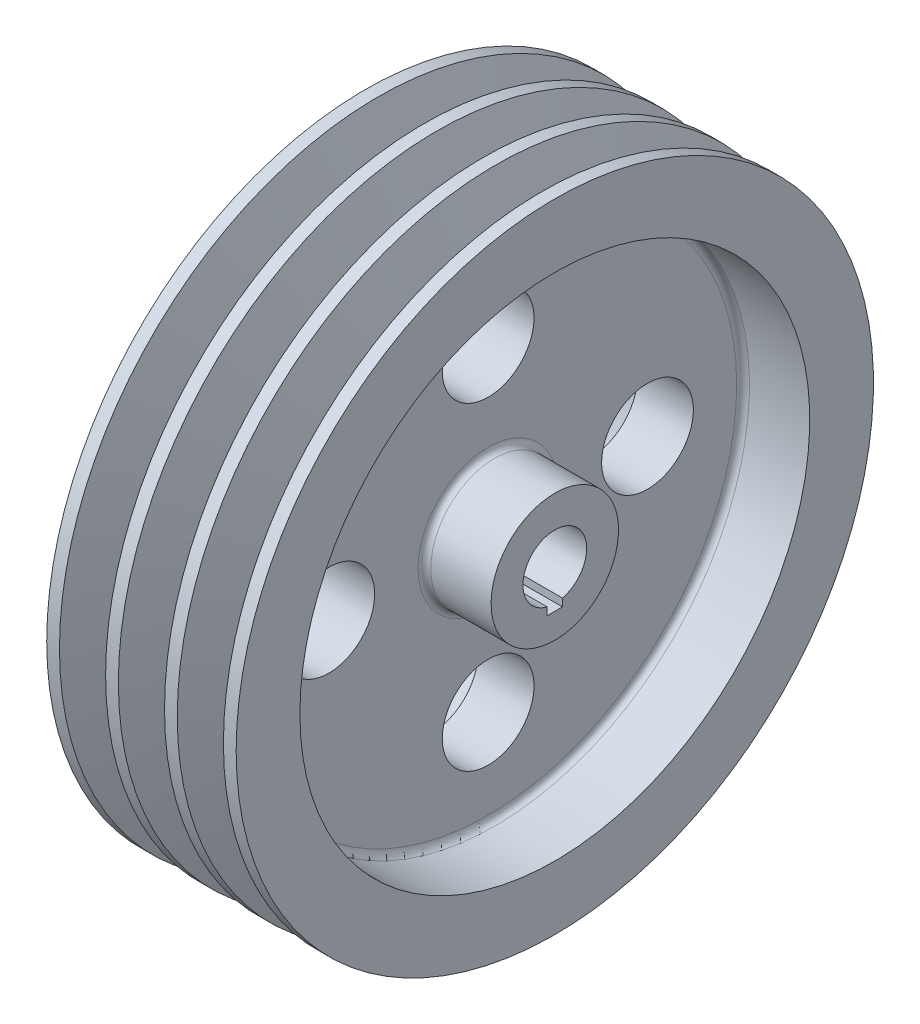
ISO-10303-21;
HEADER;
FILE_DESCRIPTION(('STEP AP214'),'2;1');
FILE_NAME('part.step','',(''),(''),'','','');
FILE_SCHEMA(('AUTOMOTIVE_DESIGN { 1 0 10303 214 1 1 1 1 }'));
ENDSEC;
DATA;
#1=APPLICATION_CONTEXT('core data for automotive mechanical design processes');
#2=APPLICATION_PROTOCOL_DEFINITION('international standard','automotive_design',2000,#1);
#3=PRODUCT_CONTEXT('',#1,'mechanical');
#4=PRODUCT('Part','Part','',(#3));
#5=PRODUCT_RELATED_PRODUCT_CATEGORY('part','',(#4));
#6=PRODUCT_DEFINITION_FORMATION('','',#4);
#7=PRODUCT_DEFINITION_CONTEXT('part definition',#1,'design');
#8=PRODUCT_DEFINITION('design','',#6,#7);
#9=PRODUCT_DEFINITION_SHAPE('','',#8);
#10=(LENGTH_UNIT() NAMED_UNIT(*) SI_UNIT(.MILLI.,.METRE.));
#11=(NAMED_UNIT(*) PLANE_ANGLE_UNIT() SI_UNIT($,.RADIAN.));
#12=(NAMED_UNIT(*) SI_UNIT($,.STERADIAN.) SOLID_ANGLE_UNIT());
#13=UNCERTAINTY_MEASURE_WITH_UNIT(LENGTH_MEASURE(1.E-05),#10,'distance_accuracy_value','');
#14=(GEOMETRIC_REPRESENTATION_CONTEXT(3) GLOBAL_UNCERTAINTY_ASSIGNED_CONTEXT((#13)) GLOBAL_UNIT_ASSIGNED_CONTEXT((#10,
#11,#12)) REPRESENTATION_CONTEXT('',''));
#15=CARTESIAN_POINT('',(0.,0.,0.));
#16=DIRECTION('',(0.,0.,1.));
#17=DIRECTION('',(1.,0.,0.));
#18=AXIS2_PLACEMENT_3D('',#15,#16,#17);
#19=CARTESIAN_POINT('',(-67.9439781808472,0.,0.));
#20=DIRECTION('',(-1.,0.,0.));
#21=DIRECTION('',(0.,0.,1.));
#22=AXIS2_PLACEMENT_3D('',#19,#20,#21);
#23=CYLINDRICAL_SURFACE('',#22,125.);
#24=CARTESIAN_POINT('',(0.,0.,0.));
#25=DIRECTION('',(-1.,0.,0.));
#26=DIRECTION('',(0.,0.,1.));
#27=AXIS2_PLACEMENT_3D('',#24,#25,#26);
#28=CIRCLE('',#27,125.);
#29=CARTESIAN_POINT('',(0.,0.,125.));
#30=VERTEX_POINT('',#29);
#31=EDGE_CURVE('E133',#30,#30,#28,.T.);
#32=ORIENTED_EDGE('',*,*,#31,.F.);
#33=EDGE_LOOP('',(#32));
#34=FACE_BOUND('',#33,.T.);
#35=CARTESIAN_POINT('',(5.,0.,0.));
#36=DIRECTION('',(-1.,0.,0.));
#37=DIRECTION('',(0.,0.,1.));
#38=AXIS2_PLACEMENT_3D('',#35,#36,#37);
#39=CIRCLE('',#38,125.);
#40=CARTESIAN_POINT('',(5.,0.,125.));
#41=VERTEX_POINT('',#40);
#42=EDGE_CURVE('E11',#41,#41,#39,.T.);
#43=ORIENTED_EDGE('',*,*,#42,.T.);
#44=EDGE_LOOP('',(#43));
#45=FACE_BOUND('',#44,.T.);
#46=ADVANCED_FACE('F37',(#34,#45),#23,.T.);
#47=CARTESIAN_POINT('',(11.5514642167916,0.,0.));
#48=DIRECTION('',(-1.,0.,0.));
#49=DIRECTION('',(0.,0.,1.));
#50=AXIS2_PLACEMENT_3D('',#47,#48,#49);
#51=CONICAL_SURFACE('',#50,107.,1.22173047639603);
#52=ORIENTED_EDGE('',*,*,#42,.F.);
#53=EDGE_LOOP('',(#52));
#54=FACE_BOUND('',#53,.T.);
#55=CARTESIAN_POINT('',(11.5514642167916,0.,0.));
#56=DIRECTION('',(-1.,0.,0.));
#57=DIRECTION('',(0.,0.,1.));
#58=AXIS2_PLACEMENT_3D('',#55,#56,#57);
#59=CIRCLE('',#58,107.);
#60=CARTESIAN_POINT('',(11.5514642167916,0.,107.));
#61=VERTEX_POINT('',#60);
#62=EDGE_CURVE('E44',#61,#61,#59,.T.);
#63=ORIENTED_EDGE('',*,*,#62,.T.);
#64=EDGE_LOOP('',(#63));
#65=FACE_BOUND('',#64,.T.);
#66=ADVANCED_FACE('F211',(#54,#65),#51,.T.);
#67=CARTESIAN_POINT('',(-67.9439781808472,0.,0.));
#68=DIRECTION('',(-1.,0.,0.));
#69=DIRECTION('',(0.,0.,1.));
#70=AXIS2_PLACEMENT_3D('',#67,#68,#69);
#71=CYLINDRICAL_SURFACE('',#70,107.);
#72=ORIENTED_EDGE('',*,*,#62,.F.);
#73=EDGE_LOOP('',(#72));
#74=FACE_BOUND('',#73,.T.);
#75=CARTESIAN_POINT('',(16.5514642167916,0.,0.));
#76=DIRECTION('',(-1.,0.,0.));
#77=DIRECTION('',(0.,0.,1.));
#78=AXIS2_PLACEMENT_3D('',#75,#76,#77);
#79=CIRCLE('',#78,107.);
#80=CARTESIAN_POINT('',(16.5514642167916,0.,107.));
#81=VERTEX_POINT('',#80);
#82=EDGE_CURVE('E206',#81,#81,#79,.T.);
#83=ORIENTED_EDGE('',*,*,#82,.T.);
#84=EDGE_LOOP('',(#83));
#85=FACE_BOUND('',#84,.T.);
#86=ADVANCED_FACE('F213',(#74,#85),#71,.T.);
#87=CARTESIAN_POINT('',(23.1029284335832,0.,0.));
#88=DIRECTION('',(1.,0.,0.));
#89=DIRECTION('',(0.,0.,-1.));
#90=AXIS2_PLACEMENT_3D('',#87,#88,#89);
#91=CONICAL_SURFACE('',#90,125.,1.22173047639603);
#92=ORIENTED_EDGE('',*,*,#82,.F.);
#93=EDGE_LOOP('',(#92));
#94=FACE_BOUND('',#93,.T.);
#95=CARTESIAN_POINT('',(23.1029284335832,0.,0.));
#96=DIRECTION('',(-1.,0.,0.));
#97=DIRECTION('',(0.,0.,1.));
#98=AXIS2_PLACEMENT_3D('',#95,#96,#97);
#99=CIRCLE('',#98,125.);
#100=CARTESIAN_POINT('',(23.1029284335832,0.,125.));
#101=VERTEX_POINT('',#100);
#102=EDGE_CURVE('E203',#101,#101,#99,.T.);
#103=ORIENTED_EDGE('',*,*,#102,.T.);
#104=EDGE_LOOP('',(#103));
#105=FACE_BOUND('',#104,.T.);
#106=ADVANCED_FACE('F216',(#94,#105),#91,.T.);
#107=CARTESIAN_POINT('',(-67.9439781808472,0.,0.));
#108=DIRECTION('',(-1.,0.,0.));
#109=DIRECTION('',(0.,0.,1.));
#110=AXIS2_PLACEMENT_3D('',#107,#108,#109);
#111=CYLINDRICAL_SURFACE('',#110,125.);
#112=ORIENTED_EDGE('',*,*,#102,.F.);
#113=EDGE_LOOP('',(#112));
#114=FACE_BOUND('',#113,.T.);
#115=CARTESIAN_POINT('',(28.1029284335832,0.,0.));
#116=DIRECTION('',(-1.,0.,0.));
#117=DIRECTION('',(0.,0.,1.));
#118=AXIS2_PLACEMENT_3D('',#115,#116,#117);
#119=CIRCLE('',#118,125.);
#120=CARTESIAN_POINT('',(28.1029284335832,0.,125.));
#121=VERTEX_POINT('',#120);
#122=EDGE_CURVE('E200',#121,#121,#119,.T.);
#123=ORIENTED_EDGE('',*,*,#122,.T.);
#124=EDGE_LOOP('',(#123));
#125=FACE_BOUND('',#124,.T.);
#126=ADVANCED_FACE('F222',(#114,#125),#111,.T.);
#127=CARTESIAN_POINT('',(34.6543926503748,0.,0.));
#128=DIRECTION('',(-1.,0.,0.));
#129=DIRECTION('',(0.,0.,1.));
#130=AXIS2_PLACEMENT_3D('',#127,#128,#129);
#131=CONICAL_SURFACE('',#130,107.,1.22173047639603);
#132=ORIENTED_EDGE('',*,*,#122,.F.);
#133=EDGE_LOOP('',(#132));
#134=FACE_BOUND('',#133,.T.);
#135=CARTESIAN_POINT('',(34.6543926503748,0.,0.));
#136=DIRECTION('',(-1.,0.,0.));
#137=DIRECTION('',(0.,0.,1.));
#138=AXIS2_PLACEMENT_3D('',#135,#136,#137);
#139=CIRCLE('',#138,107.);
#140=CARTESIAN_POINT('',(34.6543926503748,0.,107.));
#141=VERTEX_POINT('',#140);
#142=EDGE_CURVE('E197',#141,#141,#139,.T.);
#143=ORIENTED_EDGE('',*,*,#142,.T.);
#144=EDGE_LOOP('',(#143));
#145=FACE_BOUND('',#144,.T.);
#146=ADVANCED_FACE('F228',(#134,#145),#131,.T.);
#147=CARTESIAN_POINT('',(-67.9439781808472,0.,0.));
#148=DIRECTION('',(-1.,0.,0.));
#149=DIRECTION('',(0.,0.,1.));
#150=AXIS2_PLACEMENT_3D('',#147,#148,#149);
#151=CYLINDRICAL_SURFACE('',#150,107.);
#152=ORIENTED_EDGE('',*,*,#142,.F.);
#153=EDGE_LOOP('',(#152));
#154=FACE_BOUND('',#153,.T.);
#155=CARTESIAN_POINT('',(39.6543926503748,0.,0.));
#156=DIRECTION('',(-1.,0.,0.));
#157=DIRECTION('',(0.,0.,1.));
#158=AXIS2_PLACEMENT_3D('',#155,#156,#157);
#159=CIRCLE('',#158,107.);
#160=CARTESIAN_POINT('',(39.6543926503748,0.,107.));
#161=VERTEX_POINT('',#160);
#162=EDGE_CURVE('E194',#161,#161,#159,.T.);
#163=ORIENTED_EDGE('',*,*,#162,.T.);
#164=EDGE_LOOP('',(#163));
#165=FACE_BOUND('',#164,.T.);
#166=ADVANCED_FACE('F234',(#154,#165),#151,.T.);
#167=CARTESIAN_POINT('',(46.2058568671665,0.,0.));
#168=DIRECTION('',(1.,0.,0.));
#169=DIRECTION('',(0.,0.,-1.));
#170=AXIS2_PLACEMENT_3D('',#167,#168,#169);
#171=CONICAL_SURFACE('',#170,125.,1.22173047639603);
#172=ORIENTED_EDGE('',*,*,#162,.F.);
#173=EDGE_LOOP('',(#172));
#174=FACE_BOUND('',#173,.T.);
#175=CARTESIAN_POINT('',(46.2058568671665,0.,0.));
#176=DIRECTION('',(-1.,0.,0.));
#177=DIRECTION('',(0.,0.,1.));
#178=AXIS2_PLACEMENT_3D('',#175,#176,#177);
#179=CIRCLE('',#178,125.);
#180=CARTESIAN_POINT('',(46.2058568671665,0.,125.));
#181=VERTEX_POINT('',#180);
#182=EDGE_CURVE('E191',#181,#181,#179,.T.);
#183=ORIENTED_EDGE('',*,*,#182,.T.);
#184=EDGE_LOOP('',(#183));
#185=FACE_BOUND('',#184,.T.);
#186=ADVANCED_FACE('F240',(#174,#185),#171,.T.);
#187=CARTESIAN_POINT('',(-67.9439781808472,0.,0.));
#188=DIRECTION('',(-1.,0.,0.));
#189=DIRECTION('',(0.,0.,1.));
#190=AXIS2_PLACEMENT_3D('',#187,#188,#189);
#191=CYLINDRICAL_SURFACE('',#190,125.);
#192=ORIENTED_EDGE('',*,*,#182,.F.);
#193=EDGE_LOOP('',(#192));
#194=FACE_BOUND('',#193,.T.);
#195=CARTESIAN_POINT('',(51.2058568671665,0.,0.));
#196=DIRECTION('',(-1.,0.,0.));
#197=DIRECTION('',(0.,0.,1.));
#198=AXIS2_PLACEMENT_3D('',#195,#196,#197);
#199=CIRCLE('',#198,125.);
#200=CARTESIAN_POINT('',(51.2058568671665,0.,125.));
#201=VERTEX_POINT('',#200);
#202=EDGE_CURVE('E188',#201,#201,#199,.T.);
#203=ORIENTED_EDGE('',*,*,#202,.T.);
#204=EDGE_LOOP('',(#203));
#205=FACE_BOUND('',#204,.T.);
#206=ADVANCED_FACE('F246',(#194,#205),#191,.T.);
#207=CARTESIAN_POINT('',(57.757321083958,0.,0.));
#208=DIRECTION('',(-1.,0.,0.));
#209=DIRECTION('',(0.,0.,1.));
#210=AXIS2_PLACEMENT_3D('',#207,#208,#209);
#211=CONICAL_SURFACE('',#210,107.,1.22173047639604);
#212=ORIENTED_EDGE('',*,*,#202,.F.);
#213=EDGE_LOOP('',(#212));
#214=FACE_BOUND('',#213,.T.);
#215=CARTESIAN_POINT('',(57.757321083958,0.,0.));
#216=DIRECTION('',(-1.,0.,0.));
#217=DIRECTION('',(0.,0.,1.));
#218=AXIS2_PLACEMENT_3D('',#215,#216,#217);
#219=CIRCLE('',#218,107.);
#220=CARTESIAN_POINT('',(57.757321083958,0.,107.));
#221=VERTEX_POINT('',#220);
#222=EDGE_CURVE('E185',#221,#221,#219,.T.);
#223=ORIENTED_EDGE('',*,*,#222,.T.);
#224=EDGE_LOOP('',(#223));
#225=FACE_BOUND('',#224,.T.);
#226=ADVANCED_FACE('F252',(#214,#225),#211,.T.);
#227=CARTESIAN_POINT('',(-67.9439781808472,0.,0.));
#228=DIRECTION('',(-1.,0.,0.));
#229=DIRECTION('',(0.,0.,1.));
#230=AXIS2_PLACEMENT_3D('',#227,#228,#229);
#231=CYLINDRICAL_SURFACE('',#230,107.);
#232=ORIENTED_EDGE('',*,*,#222,.F.);
#233=EDGE_LOOP('',(#232));
#234=FACE_BOUND('',#233,.T.);
#235=CARTESIAN_POINT('',(62.757321083958,0.,0.));
#236=DIRECTION('',(-1.,0.,0.));
#237=DIRECTION('',(0.,0.,1.));
#238=AXIS2_PLACEMENT_3D('',#235,#236,#237);
#239=CIRCLE('',#238,107.);
#240=CARTESIAN_POINT('',(62.757321083958,0.,107.));
#241=VERTEX_POINT('',#240);
#242=EDGE_CURVE('E182',#241,#241,#239,.T.);
#243=ORIENTED_EDGE('',*,*,#242,.T.);
#244=EDGE_LOOP('',(#243));
#245=FACE_BOUND('',#244,.T.);
#246=ADVANCED_FACE('F258',(#234,#245),#231,.T.);
#247=CARTESIAN_POINT('',(69.3087853007496,0.,0.));
#248=DIRECTION('',(1.,0.,0.));
#249=DIRECTION('',(0.,0.,-1.));
#250=AXIS2_PLACEMENT_3D('',#247,#248,#249);
#251=CONICAL_SURFACE('',#250,125.,1.22173047639603);
#252=ORIENTED_EDGE('',*,*,#242,.F.);
#253=EDGE_LOOP('',(#252));
#254=FACE_BOUND('',#253,.T.);
#255=CARTESIAN_POINT('',(69.3087853007496,0.,0.));
#256=DIRECTION('',(-1.,0.,0.));
#257=DIRECTION('',(0.,0.,1.));
#258=AXIS2_PLACEMENT_3D('',#255,#256,#257);
#259=CIRCLE('',#258,125.);
#260=CARTESIAN_POINT('',(69.3087853007496,0.,125.));
#261=VERTEX_POINT('',#260);
#262=EDGE_CURVE('E179',#261,#261,#259,.T.);
#263=ORIENTED_EDGE('',*,*,#262,.T.);
#264=EDGE_LOOP('',(#263));
#265=FACE_BOUND('',#264,.T.);
#266=ADVANCED_FACE('F264',(#254,#265),#251,.T.);
#267=CARTESIAN_POINT('',(-67.9439781808472,0.,0.));
#268=DIRECTION('',(-1.,0.,0.));
#269=DIRECTION('',(0.,0.,1.));
#270=AXIS2_PLACEMENT_3D('',#267,#268,#269);
#271=CYLINDRICAL_SURFACE('',#270,125.);
#272=ORIENTED_EDGE('',*,*,#262,.F.);
#273=EDGE_LOOP('',(#272));
#274=FACE_BOUND('',#273,.T.);
#275=CARTESIAN_POINT('',(74.3087853007496,0.,0.));
#276=DIRECTION('',(-1.,0.,0.));
#277=DIRECTION('',(0.,0.,1.));
#278=AXIS2_PLACEMENT_3D('',#275,#276,#277);
#279=CIRCLE('',#278,125.);
#280=CARTESIAN_POINT('',(74.3087853007496,0.,125.));
#281=VERTEX_POINT('',#280);
#282=EDGE_CURVE('E176',#281,#281,#279,.T.);
#283=ORIENTED_EDGE('',*,*,#282,.T.);
#284=EDGE_LOOP('',(#283));
#285=FACE_BOUND('',#284,.T.);
#286=ADVANCED_FACE('F270',(#274,#285),#271,.T.);
#287=CARTESIAN_POINT('',(74.3087853007496,0.,-125.));
#288=DIRECTION('',(-1.,0.,0.));
#289=DIRECTION('',(0.,0.,1.));
#290=AXIS2_PLACEMENT_3D('',#287,#288,#289);
#291=PLANE('',#290);
#292=ORIENTED_EDGE('',*,*,#282,.F.);
#293=EDGE_LOOP('',(#292));
#294=FACE_BOUND('',#293,.T.);
#295=CARTESIAN_POINT('',(74.3087853007496,0.,0.));
#296=DIRECTION('',(-1.,0.,0.));
#297=DIRECTION('',(0.,0.,1.));
#298=AXIS2_PLACEMENT_3D('',#295,#296,#297);
#299=CIRCLE('',#298,100.);
#300=CARTESIAN_POINT('',(74.3087853007496,0.,100.));
#301=VERTEX_POINT('',#300);
#302=EDGE_CURVE('E173',#301,#301,#299,.T.);
#303=ORIENTED_EDGE('',*,*,#302,.T.);
#304=EDGE_LOOP('',(#303));
#305=FACE_BOUND('',#304,.T.);
#306=ADVANCED_FACE('F276',(#294,#305),#291,.F.);
#307=CARTESIAN_POINT('',(-67.9439781808472,0.,0.));
#308=DIRECTION('',(-1.,0.,0.));
#309=DIRECTION('',(0.,0.,1.));
#310=AXIS2_PLACEMENT_3D('',#307,#308,#309);
#311=CYLINDRICAL_SURFACE('',#310,100.);
#312=ORIENTED_EDGE('',*,*,#302,.F.);
#313=EDGE_LOOP('',(#312));
#314=FACE_BOUND('',#313,.T.);
#315=CARTESIAN_POINT('',(50.6543926503748,0.,0.));
#316=DIRECTION('',(-1.,0.,0.));
#317=DIRECTION('',(0.,0.,1.));
#318=AXIS2_PLACEMENT_3D('',#315,#316,#317);
#319=CIRCLE('',#318,100.);
#320=CARTESIAN_POINT('',(50.6543926503748,0.,100.));
#321=VERTEX_POINT('',#320);
#322=EDGE_CURVE('E170',#321,#321,#319,.T.);
#323=ORIENTED_EDGE('',*,*,#322,.T.);
#324=EDGE_LOOP('',(#323));
#325=FACE_BOUND('',#324,.T.);
#326=ADVANCED_FACE('F282',(#314,#325),#311,.F.);
#327=CARTESIAN_POINT('',(50.6543926503748,0.,0.));
#328=DIRECTION('',(-1.,0.,0.));
#329=DIRECTION('',(0.,0.,1.));
#330=AXIS2_PLACEMENT_3D('',#327,#328,#329);
#331=TOROIDAL_SURFACE('',#330,97.5,2.5);
#332=ORIENTED_EDGE('',*,*,#322,.F.);
#333=EDGE_LOOP('',(#332));
#334=FACE_BOUND('',#333,.T.);
#335=CARTESIAN_POINT('',(48.1543926503748,0.,0.));
#336=DIRECTION('',(-1.,0.,0.));
#337=DIRECTION('',(0.,0.,1.));
#338=AXIS2_PLACEMENT_3D('',#335,#336,#337);
#339=CIRCLE('',#338,97.5);
#340=CARTESIAN_POINT('',(48.1543926503748,0.,97.5));
#341=VERTEX_POINT('',#340);
#342=EDGE_CURVE('E167',#341,#341,#339,.T.);
#343=ORIENTED_EDGE('',*,*,#342,.T.);
#344=EDGE_LOOP('',(#343));
#345=FACE_BOUND('',#344,.T.);
#346=ADVANCED_FACE('F288',(#334,#345),#331,.F.);
#347=CARTESIAN_POINT('',(48.1543926503748,0.,-97.5));
#348=DIRECTION('',(-1.,0.,0.));
#349=DIRECTION('',(0.,0.,1.));
#350=AXIS2_PLACEMENT_3D('',#347,#348,#349);
#351=PLANE('',#350);
#352=CARTESIAN_POINT('',(48.1543926503748,62.5,0.));
#353=DIRECTION('',(-1.,0.,0.));
#354=DIRECTION('',(0.,0.,1.));
#355=AXIS2_PLACEMENT_3D('',#352,#353,#354);
#356=CIRCLE('',#355,18.);
#357=CARTESIAN_POINT('',(48.1543926503748,62.5,18.));
#358=VERTEX_POINT('',#357);
#359=EDGE_CURVE('E130',#358,#358,#356,.T.);
#360=ORIENTED_EDGE('',*,*,#359,.T.);
#361=EDGE_LOOP('',(#360));
#362=FACE_BOUND('',#361,.T.);
#363=CARTESIAN_POINT('',(48.1543926503748,-2.18217583677696E-13,62.5));
#364=DIRECTION('',(-1.,0.,0.));
#365=DIRECTION('',(0.,0.,1.));
#366=AXIS2_PLACEMENT_3D('',#363,#364,#365);
#367=CIRCLE('',#366,18.);
#368=CARTESIAN_POINT('',(48.1543926503748,-2.18217583677696E-13,80.5));
#369=VERTEX_POINT('',#368);
#370=EDGE_CURVE('E127',#369,#369,#367,.T.);
#371=ORIENTED_EDGE('',*,*,#370,.T.);
#372=EDGE_LOOP('',(#371));
#373=FACE_BOUND('',#372,.T.);
#374=CARTESIAN_POINT('',(48.1543926503748,-62.5,3.52975155131649E-12));
#375=DIRECTION('',(-1.,0.,0.));
#376=DIRECTION('',(0.,0.,1.));
#377=AXIS2_PLACEMENT_3D('',#374,#375,#376);
#378=CIRCLE('',#377,18.0000000000038);
#379=CARTESIAN_POINT('',(48.1543926503748,-62.5,18.0000000000073));
#380=VERTEX_POINT('',#379);
#381=EDGE_CURVE('E124',#380,#380,#378,.T.);
#382=ORIENTED_EDGE('',*,*,#381,.T.);
#383=EDGE_LOOP('',(#382));
#384=FACE_BOUND('',#383,.T.);
#385=CARTESIAN_POINT('',(48.1543926503748,6.54652751033088E-13,-62.5));
#386=DIRECTION('',(-1.,0.,0.));
#387=DIRECTION('',(0.,0.,1.));
#388=AXIS2_PLACEMENT_3D('',#385,#386,#387);
#389=CIRCLE('',#388,18.);
#390=CARTESIAN_POINT('',(48.1543926503748,6.54652751033088E-13,-44.5));
#391=VERTEX_POINT('',#390);
#392=EDGE_CURVE('E113',#391,#391,#389,.T.);
#393=ORIENTED_EDGE('',*,*,#392,.T.);
#394=EDGE_LOOP('',(#393));
#395=FACE_BOUND('',#394,.T.);
#396=ORIENTED_EDGE('',*,*,#342,.F.);
#397=EDGE_LOOP('',(#396));
#398=FACE_BOUND('',#397,.T.);
#399=CARTESIAN_POINT('',(48.1543926503748,0.,0.));
#400=DIRECTION('',(-1.,0.,0.));
#401=DIRECTION('',(0.,0.,1.));
#402=AXIS2_PLACEMENT_3D('',#399,#400,#401);
#403=CIRCLE('',#402,27.5);
#404=CARTESIAN_POINT('',(48.1543926503748,0.,27.5));
#405=VERTEX_POINT('',#404);
#406=EDGE_CURVE('E164',#405,#405,#403,.T.);
#407=ORIENTED_EDGE('',*,*,#406,.T.);
#408=EDGE_LOOP('',(#407));
#409=FACE_BOUND('',#408,.T.);
#410=ADVANCED_FACE('F294',(#362,#373,#384,#395,#398,#409),#351,.F.);
#411=CARTESIAN_POINT('',(50.6543926503748,0.,0.));
#412=DIRECTION('',(-1.,0.,0.));
#413=DIRECTION('',(0.,0.,1.));
#414=AXIS2_PLACEMENT_3D('',#411,#412,#413);
#415=TOROIDAL_SURFACE('',#414,27.5,2.5);
#416=ORIENTED_EDGE('',*,*,#406,.F.);
#417=EDGE_LOOP('',(#416));
#418=FACE_BOUND('',#417,.T.);
#419=CARTESIAN_POINT('',(50.6543926503748,0.,0.));
#420=DIRECTION('',(-1.,0.,0.));
#421=DIRECTION('',(0.,0.,1.));
#422=AXIS2_PLACEMENT_3D('',#419,#420,#421);
#423=CIRCLE('',#422,25.);
#424=CARTESIAN_POINT('',(50.6543926503748,0.,25.));
#425=VERTEX_POINT('',#424);
#426=EDGE_CURVE('E161',#425,#425,#423,.T.);
#427=ORIENTED_EDGE('',*,*,#426,.T.);
#428=EDGE_LOOP('',(#427));
#429=FACE_BOUND('',#428,.T.);
#430=ADVANCED_FACE('F300',(#418,#429),#415,.F.);
#431=CARTESIAN_POINT('',(-67.9439781808472,0.,0.));
#432=DIRECTION('',(-1.,0.,0.));
#433=DIRECTION('',(0.,0.,1.));
#434=AXIS2_PLACEMENT_3D('',#431,#432,#433);
#435=CYLINDRICAL_SURFACE('',#434,25.);
#436=ORIENTED_EDGE('',*,*,#426,.F.);
#437=EDGE_LOOP('',(#436));
#438=FACE_BOUND('',#437,.T.);
#439=CARTESIAN_POINT('',(74.3087853007496,0.,0.));
#440=DIRECTION('',(-1.,0.,0.));
#441=DIRECTION('',(0.,0.,1.));
#442=AXIS2_PLACEMENT_3D('',#439,#440,#441);
#443=CIRCLE('',#442,25.);
#444=CARTESIAN_POINT('',(74.3087853007496,0.,25.));
#445=VERTEX_POINT('',#444);
#446=EDGE_CURVE('E158',#445,#445,#443,.T.);
#447=ORIENTED_EDGE('',*,*,#446,.T.);
#448=EDGE_LOOP('',(#447));
#449=FACE_BOUND('',#448,.T.);
#450=ADVANCED_FACE('F307',(#438,#449),#435,.T.);
#451=CARTESIAN_POINT('',(74.3087853007496,0.,-22.5));
#452=DIRECTION('',(-1.,0.,0.));
#453=DIRECTION('',(0.,0.,1.));
#454=AXIS2_PLACEMENT_3D('',#451,#452,#453);
#455=PLANE('',#454);
#456=ORIENTED_EDGE('',*,*,#446,.F.);
#457=EDGE_LOOP('',(#456));
#458=FACE_BOUND('',#457,.T.);
#459=DIRECTION('',(0.,0.,1.));
#460=VECTOR('',#459,1.);
#461=CARTESIAN_POINT('',(74.3087853007496,-15.1346610995116,-3.));
#462=LINE('',#461,#460);
#463=CARTESIAN_POINT('',(74.3087853007496,-15.1346610995116,-3.));
#464=VERTEX_POINT('',#463);
#465=CARTESIAN_POINT('',(74.3087853007496,-15.1346610995116,3.));
#466=VERTEX_POINT('',#465);
#467=EDGE_CURVE('E90',#464,#466,#462,.T.);
#468=ORIENTED_EDGE('',*,*,#467,.T.);
#469=DIRECTION('',(0.,1.,0.));
#470=VECTOR('',#469,1.);
#471=CARTESIAN_POINT('',(74.3087853007496,-15.1346610995116,3.));
#472=LINE('',#471,#470);
#473=CARTESIAN_POINT('',(74.3087853007496,-12.1346610995116,3.));
#474=VERTEX_POINT('',#473);
#475=EDGE_CURVE('E93',#466,#474,#472,.T.);
#476=ORIENTED_EDGE('',*,*,#475,.T.);
#477=CARTESIAN_POINT('',(74.3087853007496,0.,0.));
#478=DIRECTION('',(-1.,0.,0.));
#479=DIRECTION('',(0.,0.,1.));
#480=AXIS2_PLACEMENT_3D('',#477,#478,#479);
#481=CIRCLE('',#480,12.5);
#482=CARTESIAN_POINT('',(74.3087853007496,-12.1346610995116,-3.));
#483=VERTEX_POINT('',#482);
#484=EDGE_CURVE('E98',#474,#483,#481,.T.);
#485=ORIENTED_EDGE('',*,*,#484,.T.);
#486=DIRECTION('',(0.,-1.,0.));
#487=VECTOR('',#486,1.);
#488=CARTESIAN_POINT('',(74.3087853007496,-12.1346610995116,-3.));
#489=LINE('',#488,#487);
#490=EDGE_CURVE('E79',#483,#464,#489,.T.);
#491=ORIENTED_EDGE('',*,*,#490,.T.);
#492=EDGE_LOOP('',(#468,#476,#485,#491));
#493=FACE_BOUND('',#492,.T.);
#494=ADVANCED_FACE('F96',(#458,#493),#455,.F.);
#495=CARTESIAN_POINT('',(-67.9439781808472,0.,0.));
#496=DIRECTION('',(-1.,0.,0.));
#497=DIRECTION('',(0.,0.,1.));
#498=AXIS2_PLACEMENT_3D('',#495,#496,#497);
#499=CYLINDRICAL_SURFACE('',#498,12.5);
#500=ORIENTED_EDGE('',*,*,#484,.F.);
#501=DIRECTION('',(-1.,0.,0.));
#502=VECTOR('',#501,1.);
#503=CARTESIAN_POINT('',(74.3087853007496,-12.1346610995116,3.));
#504=LINE('',#503,#502);
#505=CARTESIAN_POINT('',(0.,-12.1346610995116,3.));
#506=VERTEX_POINT('',#505);
#507=EDGE_CURVE('E60',#474,#506,#504,.T.);
#508=ORIENTED_EDGE('',*,*,#507,.T.);
#509=CARTESIAN_POINT('',(0.,0.,0.));
#510=DIRECTION('',(-1.,0.,0.));
#511=DIRECTION('',(0.,0.,1.));
#512=AXIS2_PLACEMENT_3D('',#509,#510,#511);
#513=CIRCLE('',#512,12.5);
#514=CARTESIAN_POINT('',(0.,-12.1346610995116,-3.));
#515=VERTEX_POINT('',#514);
#516=EDGE_CURVE('E154',#506,#515,#513,.T.);
#517=ORIENTED_EDGE('',*,*,#516,.T.);
#518=DIRECTION('',(-1.,0.,0.));
#519=VECTOR('',#518,1.);
#520=CARTESIAN_POINT('',(74.3087853007496,-12.1346610995116,-3.));
#521=LINE('',#520,#519);
#522=EDGE_CURVE('E51',#483,#515,#521,.T.);
#523=ORIENTED_EDGE('',*,*,#522,.F.);
#524=EDGE_LOOP('',(#500,#508,#517,#523));
#525=FACE_BOUND('',#524,.T.);
#526=ADVANCED_FACE('F317',(#525),#499,.F.);
#527=CARTESIAN_POINT('',(0.,0.,-25.));
#528=DIRECTION('',(1.,0.,0.));
#529=DIRECTION('',(0.,0.,-1.));
#530=AXIS2_PLACEMENT_3D('',#527,#528,#529);
#531=PLANE('',#530);
#532=ORIENTED_EDGE('',*,*,#516,.F.);
#533=DIRECTION('',(0.,1.,0.));
#534=VECTOR('',#533,1.);
#535=CARTESIAN_POINT('',(0.,-15.1346610995116,3.));
#536=LINE('',#535,#534);
#537=CARTESIAN_POINT('',(0.,-15.1346610995116,3.));
#538=VERTEX_POINT('',#537);
#539=EDGE_CURVE('E75',#538,#506,#536,.T.);
#540=ORIENTED_EDGE('',*,*,#539,.F.);
#541=DIRECTION('',(0.,0.,1.));
#542=VECTOR('',#541,1.);
#543=CARTESIAN_POINT('',(0.,-15.1346610995116,-3.));
#544=LINE('',#543,#542);
#545=CARTESIAN_POINT('',(0.,-15.1346610995116,-3.));
#546=VERTEX_POINT('',#545);
#547=EDGE_CURVE('E100',#546,#538,#544,.T.);
#548=ORIENTED_EDGE('',*,*,#547,.F.);
#549=DIRECTION('',(0.,-1.,0.));
#550=VECTOR('',#549,1.);
#551=CARTESIAN_POINT('',(0.,-12.1346610995116,-3.));
#552=LINE('',#551,#550);
#553=EDGE_CURVE('E83',#515,#546,#552,.T.);
#554=ORIENTED_EDGE('',*,*,#553,.F.);
#555=EDGE_LOOP('',(#532,#540,#548,#554));
#556=FACE_BOUND('',#555,.T.);
#557=CARTESIAN_POINT('',(0.,0.,0.));
#558=DIRECTION('',(-1.,0.,0.));
#559=DIRECTION('',(0.,0.,1.));
#560=AXIS2_PLACEMENT_3D('',#557,#558,#559);
#561=CIRCLE('',#560,25.);
#562=CARTESIAN_POINT('',(0.,0.,25.));
#563=VERTEX_POINT('',#562);
#564=EDGE_CURVE('E151',#563,#563,#561,.T.);
#565=ORIENTED_EDGE('',*,*,#564,.T.);
#566=EDGE_LOOP('',(#565));
#567=FACE_BOUND('',#566,.T.);
#568=ADVANCED_FACE('F323',(#556,#567),#531,.F.);
#569=CARTESIAN_POINT('',(-67.9439781808472,0.,0.));
#570=DIRECTION('',(-1.,0.,0.));
#571=DIRECTION('',(0.,0.,1.));
#572=AXIS2_PLACEMENT_3D('',#569,#570,#571);
#573=CYLINDRICAL_SURFACE('',#572,25.);
#574=ORIENTED_EDGE('',*,*,#564,.F.);
#575=EDGE_LOOP('',(#574));
#576=FACE_BOUND('',#575,.T.);
#577=CARTESIAN_POINT('',(23.6543926503748,0.,0.));
#578=DIRECTION('',(-1.,0.,0.));
#579=DIRECTION('',(0.,0.,1.));
#580=AXIS2_PLACEMENT_3D('',#577,#578,#579);
#581=CIRCLE('',#580,25.);
#582=CARTESIAN_POINT('',(23.6543926503748,0.,25.));
#583=VERTEX_POINT('',#582);
#584=EDGE_CURVE('E148',#583,#583,#581,.T.);
#585=ORIENTED_EDGE('',*,*,#584,.T.);
#586=EDGE_LOOP('',(#585));
#587=FACE_BOUND('',#586,.T.);
#588=ADVANCED_FACE('F365',(#576,#587),#573,.T.);
#589=CARTESIAN_POINT('',(23.6543926503748,0.,0.));
#590=DIRECTION('',(-1.,0.,0.));
#591=DIRECTION('',(0.,0.,1.));
#592=AXIS2_PLACEMENT_3D('',#589,#590,#591);
#593=TOROIDAL_SURFACE('',#592,27.5,2.5);
#594=ORIENTED_EDGE('',*,*,#584,.F.);
#595=EDGE_LOOP('',(#594));
#596=FACE_BOUND('',#595,.T.);
#597=CARTESIAN_POINT('',(26.1543926503748,0.,0.));
#598=DIRECTION('',(-1.,0.,0.));
#599=DIRECTION('',(0.,0.,1.));
#600=AXIS2_PLACEMENT_3D('',#597,#598,#599);
#601=CIRCLE('',#600,27.5);
#602=CARTESIAN_POINT('',(26.1543926503748,0.,27.5));
#603=VERTEX_POINT('',#602);
#604=EDGE_CURVE('E145',#603,#603,#601,.T.);
#605=ORIENTED_EDGE('',*,*,#604,.T.);
#606=EDGE_LOOP('',(#605));
#607=FACE_BOUND('',#606,.T.);
#608=ADVANCED_FACE('F361',(#596,#607),#593,.F.);
#609=CARTESIAN_POINT('',(26.1543926503748,0.,-97.5));
#610=DIRECTION('',(1.,0.,0.));
#611=DIRECTION('',(0.,0.,-1.));
#612=AXIS2_PLACEMENT_3D('',#609,#610,#611);
#613=PLANE('',#612);
#614=CARTESIAN_POINT('',(26.1543926503748,62.5,0.));
#615=DIRECTION('',(-1.,0.,0.));
#616=DIRECTION('',(0.,0.,1.));
#617=AXIS2_PLACEMENT_3D('',#614,#615,#616);
#618=CIRCLE('',#617,18.);
#619=CARTESIAN_POINT('',(26.1543926503748,62.5,18.));
#620=VERTEX_POINT('',#619);
#621=EDGE_CURVE('E110',#620,#620,#618,.T.);
#622=ORIENTED_EDGE('',*,*,#621,.F.);
#623=EDGE_LOOP('',(#622));
#624=FACE_BOUND('',#623,.T.);
#625=CARTESIAN_POINT('',(26.1543926503748,-2.18217583677696E-13,62.5));
#626=DIRECTION('',(-1.,0.,0.));
#627=DIRECTION('',(0.,0.,1.));
#628=AXIS2_PLACEMENT_3D('',#625,#626,#627);
#629=CIRCLE('',#628,18.);
#630=CARTESIAN_POINT('',(26.1543926503748,-2.18217583677696E-13,80.5));
#631=VERTEX_POINT('',#630);
#632=EDGE_CURVE('E107',#631,#631,#629,.T.);
#633=ORIENTED_EDGE('',*,*,#632,.F.);
#634=EDGE_LOOP('',(#633));
#635=FACE_BOUND('',#634,.T.);
#636=CARTESIAN_POINT('',(26.1543926503748,-62.5,3.52975155131649E-12));
#637=DIRECTION('',(-1.,0.,0.));
#638=DIRECTION('',(0.,0.,1.));
#639=AXIS2_PLACEMENT_3D('',#636,#637,#638);
#640=CIRCLE('',#639,18.0000000000038);
#641=CARTESIAN_POINT('',(26.1543926503748,-62.5,18.0000000000073));
#642=VERTEX_POINT('',#641);
#643=EDGE_CURVE('E117',#642,#642,#640,.T.);
#644=ORIENTED_EDGE('',*,*,#643,.F.);
#645=EDGE_LOOP('',(#644));
#646=FACE_BOUND('',#645,.T.);
#647=CARTESIAN_POINT('',(26.1543926503748,6.54652751033088E-13,-62.5));
#648=DIRECTION('',(-1.,0.,0.));
#649=DIRECTION('',(0.,0.,1.));
#650=AXIS2_PLACEMENT_3D('',#647,#648,#649);
#651=CIRCLE('',#650,18.);
#652=CARTESIAN_POINT('',(26.1543926503748,6.54652751033088E-13,-44.5));
#653=VERTEX_POINT('',#652);
#654=EDGE_CURVE('E114',#653,#653,#651,.T.);
#655=ORIENTED_EDGE('',*,*,#654,.F.);
#656=EDGE_LOOP('',(#655));
#657=FACE_BOUND('',#656,.T.);
#658=ORIENTED_EDGE('',*,*,#604,.F.);
#659=EDGE_LOOP('',(#658));
#660=FACE_BOUND('',#659,.T.);
#661=CARTESIAN_POINT('',(26.1543926503748,0.,0.));
#662=DIRECTION('',(-1.,0.,0.));
#663=DIRECTION('',(0.,0.,1.));
#664=AXIS2_PLACEMENT_3D('',#661,#662,#663);
#665=CIRCLE('',#664,97.5);
#666=CARTESIAN_POINT('',(26.1543926503748,0.,97.5));
#667=VERTEX_POINT('',#666);
#668=EDGE_CURVE('E142',#667,#667,#665,.T.);
#669=ORIENTED_EDGE('',*,*,#668,.T.);
#670=EDGE_LOOP('',(#669));
#671=FACE_BOUND('',#670,.T.);
#672=ADVANCED_FACE('F357',(#624,#635,#646,#657,#660,#671),#613,.F.);
#673=CARTESIAN_POINT('',(23.6543926503748,0.,0.));
#674=DIRECTION('',(-1.,0.,0.));
#675=DIRECTION('',(0.,0.,1.));
#676=AXIS2_PLACEMENT_3D('',#673,#674,#675);
#677=TOROIDAL_SURFACE('',#676,97.5,2.5);
#678=ORIENTED_EDGE('',*,*,#668,.F.);
#679=EDGE_LOOP('',(#678));
#680=FACE_BOUND('',#679,.T.);
#681=CARTESIAN_POINT('',(23.6543926503748,0.,0.));
#682=DIRECTION('',(-1.,0.,0.));
#683=DIRECTION('',(0.,0.,1.));
#684=AXIS2_PLACEMENT_3D('',#681,#682,#683);
#685=CIRCLE('',#684,100.);
#686=CARTESIAN_POINT('',(23.6543926503748,0.,100.));
#687=VERTEX_POINT('',#686);
#688=EDGE_CURVE('E139',#687,#687,#685,.T.);
#689=ORIENTED_EDGE('',*,*,#688,.T.);
#690=EDGE_LOOP('',(#689));
#691=FACE_BOUND('',#690,.T.);
#692=ADVANCED_FACE('F349',(#680,#691),#677,.F.);
#693=CARTESIAN_POINT('',(-67.9439781808472,0.,0.));
#694=DIRECTION('',(-1.,0.,0.));
#695=DIRECTION('',(0.,0.,1.));
#696=AXIS2_PLACEMENT_3D('',#693,#694,#695);
#697=CYLINDRICAL_SURFACE('',#696,100.);
#698=ORIENTED_EDGE('',*,*,#688,.F.);
#699=EDGE_LOOP('',(#698));
#700=FACE_BOUND('',#699,.T.);
#701=CARTESIAN_POINT('',(0.,0.,0.));
#702=DIRECTION('',(-1.,0.,0.));
#703=DIRECTION('',(0.,0.,1.));
#704=AXIS2_PLACEMENT_3D('',#701,#702,#703);
#705=CIRCLE('',#704,100.);
#706=CARTESIAN_POINT('',(0.,0.,100.));
#707=VERTEX_POINT('',#706);
#708=EDGE_CURVE('E136',#707,#707,#705,.T.);
#709=ORIENTED_EDGE('',*,*,#708,.T.);
#710=EDGE_LOOP('',(#709));
#711=FACE_BOUND('',#710,.T.);
#712=ADVANCED_FACE('F339',(#700,#711),#697,.F.);
#713=CARTESIAN_POINT('',(0.,0.,-125.));
#714=DIRECTION('',(1.,0.,0.));
#715=DIRECTION('',(0.,0.,-1.));
#716=AXIS2_PLACEMENT_3D('',#713,#714,#715);
#717=PLANE('',#716);
#718=ORIENTED_EDGE('',*,*,#708,.F.);
#719=EDGE_LOOP('',(#718));
#720=FACE_BOUND('',#719,.T.);
#721=ORIENTED_EDGE('',*,*,#31,.T.);
#722=EDGE_LOOP('',(#721));
#723=FACE_BOUND('',#722,.T.);
#724=ADVANCED_FACE('F336',(#720,#723),#717,.F.);
#725=CARTESIAN_POINT('',(74.3087853007496,6.54652751033088E-13,-62.5));
#726=DIRECTION('',(-1.,0.,0.));
#727=DIRECTION('',(0.,0.,1.));
#728=AXIS2_PLACEMENT_3D('',#725,#726,#727);
#729=CYLINDRICAL_SURFACE('',#728,18.);
#730=ORIENTED_EDGE('',*,*,#654,.T.);
#731=EDGE_LOOP('',(#730));
#732=FACE_BOUND('',#731,.T.);
#733=ORIENTED_EDGE('',*,*,#392,.F.);
#734=EDGE_LOOP('',(#733));
#735=FACE_BOUND('',#734,.T.);
#736=ADVANCED_FACE('F338',(#732,#735),#729,.F.);
#737=CARTESIAN_POINT('',(74.3087853007496,-62.5,3.52975155131649E-12));
#738=DIRECTION('',(-1.,0.,0.));
#739=DIRECTION('',(0.,0.,1.));
#740=AXIS2_PLACEMENT_3D('',#737,#738,#739);
#741=CYLINDRICAL_SURFACE('',#740,18.0000000000038);
#742=ORIENTED_EDGE('',*,*,#643,.T.);
#743=EDGE_LOOP('',(#742));
#744=FACE_BOUND('',#743,.T.);
#745=ORIENTED_EDGE('',*,*,#381,.F.);
#746=EDGE_LOOP('',(#745));
#747=FACE_BOUND('',#746,.T.);
#748=ADVANCED_FACE('F346',(#744,#747),#741,.F.);
#749=CARTESIAN_POINT('',(74.3087853007496,-2.18217583677696E-13,62.5));
#750=DIRECTION('',(-1.,0.,0.));
#751=DIRECTION('',(0.,0.,1.));
#752=AXIS2_PLACEMENT_3D('',#749,#750,#751);
#753=CYLINDRICAL_SURFACE('',#752,18.);
#754=ORIENTED_EDGE('',*,*,#632,.T.);
#755=EDGE_LOOP('',(#754));
#756=FACE_BOUND('',#755,.T.);
#757=ORIENTED_EDGE('',*,*,#370,.F.);
#758=EDGE_LOOP('',(#757));
#759=FACE_BOUND('',#758,.T.);
#760=ADVANCED_FACE('F428',(#756,#759),#753,.F.);
#761=CARTESIAN_POINT('',(74.3087853007496,62.5,0.));
#762=DIRECTION('',(-1.,0.,0.));
#763=DIRECTION('',(0.,0.,1.));
#764=AXIS2_PLACEMENT_3D('',#761,#762,#763);
#765=CYLINDRICAL_SURFACE('',#764,18.);
#766=ORIENTED_EDGE('',*,*,#621,.T.);
#767=EDGE_LOOP('',(#766));
#768=FACE_BOUND('',#767,.T.);
#769=ORIENTED_EDGE('',*,*,#359,.F.);
#770=EDGE_LOOP('',(#769));
#771=FACE_BOUND('',#770,.T.);
#772=ADVANCED_FACE('F397',(#768,#771),#765,.F.);
#773=CARTESIAN_POINT('',(74.3087853007496,-15.1346610995116,3.));
#774=DIRECTION('',(0.,0.,1.));
#775=DIRECTION('',(0.,-1.,0.));
#776=AXIS2_PLACEMENT_3D('',#773,#774,#775);
#777=PLANE('',#776);
#778=ORIENTED_EDGE('',*,*,#539,.T.);
#779=ORIENTED_EDGE('',*,*,#507,.F.);
#780=ORIENTED_EDGE('',*,*,#475,.F.);
#781=DIRECTION('',(-1.,0.,0.));
#782=VECTOR('',#781,1.);
#783=CARTESIAN_POINT('',(74.3087853007496,-15.1346610995116,3.));
#784=LINE('',#783,#782);
#785=EDGE_CURVE('E87',#466,#538,#784,.T.);
#786=ORIENTED_EDGE('',*,*,#785,.T.);
#787=EDGE_LOOP('',(#778,#779,#780,#786));
#788=FACE_BOUND('',#787,.T.);
#789=ADVANCED_FACE('F392',(#788),#777,.F.);
#790=CARTESIAN_POINT('',(74.3087853007496,-15.1346610995116,-3.));
#791=DIRECTION('',(0.,-1.,0.));
#792=DIRECTION('',(0.,0.,-1.));
#793=AXIS2_PLACEMENT_3D('',#790,#791,#792);
#794=PLANE('',#793);
#795=ORIENTED_EDGE('',*,*,#547,.T.);
#796=ORIENTED_EDGE('',*,*,#785,.F.);
#797=ORIENTED_EDGE('',*,*,#467,.F.);
#798=DIRECTION('',(-1.,0.,0.));
#799=VECTOR('',#798,1.);
#800=CARTESIAN_POINT('',(74.3087853007496,-15.1346610995116,-3.));
#801=LINE('',#800,#799);
#802=EDGE_CURVE('E80',#464,#546,#801,.T.);
#803=ORIENTED_EDGE('',*,*,#802,.T.);
#804=EDGE_LOOP('',(#795,#796,#797,#803));
#805=FACE_BOUND('',#804,.T.);
#806=ADVANCED_FACE('F91',(#805),#794,.F.);
#807=CARTESIAN_POINT('',(74.3087853007496,-12.1346610995116,-3.));
#808=DIRECTION('',(0.,0.,-1.));
#809=DIRECTION('',(0.,1.,0.));
#810=AXIS2_PLACEMENT_3D('',#807,#808,#809);
#811=PLANE('',#810);
#812=ORIENTED_EDGE('',*,*,#553,.T.);
#813=ORIENTED_EDGE('',*,*,#802,.F.);
#814=ORIENTED_EDGE('',*,*,#490,.F.);
#815=ORIENTED_EDGE('',*,*,#522,.T.);
#816=EDGE_LOOP('',(#812,#813,#814,#815));
#817=FACE_BOUND('',#816,.T.);
#818=ADVANCED_FACE('F82',(#817),#811,.F.);
#819=CLOSED_SHELL('',(#46,#66,#86,#106,#126,#146,#166,#186,#206,#226,#246,#266,#286,#306,#326,
#346,#410,#430,#450,#494,#526,#568,#588,#608,#672,#692,#712,#724,#736,#748,#760,#772,#789,#806,#818));
#820=MANIFOLD_SOLID_BREP('B2',#819);
#821=ADVANCED_BREP_SHAPE_REPRESENTATION('',(#18,#820),#14);
#822=SHAPE_DEFINITION_REPRESENTATION(#9,#821);
ENDSEC;
END-ISO-10303-21;
